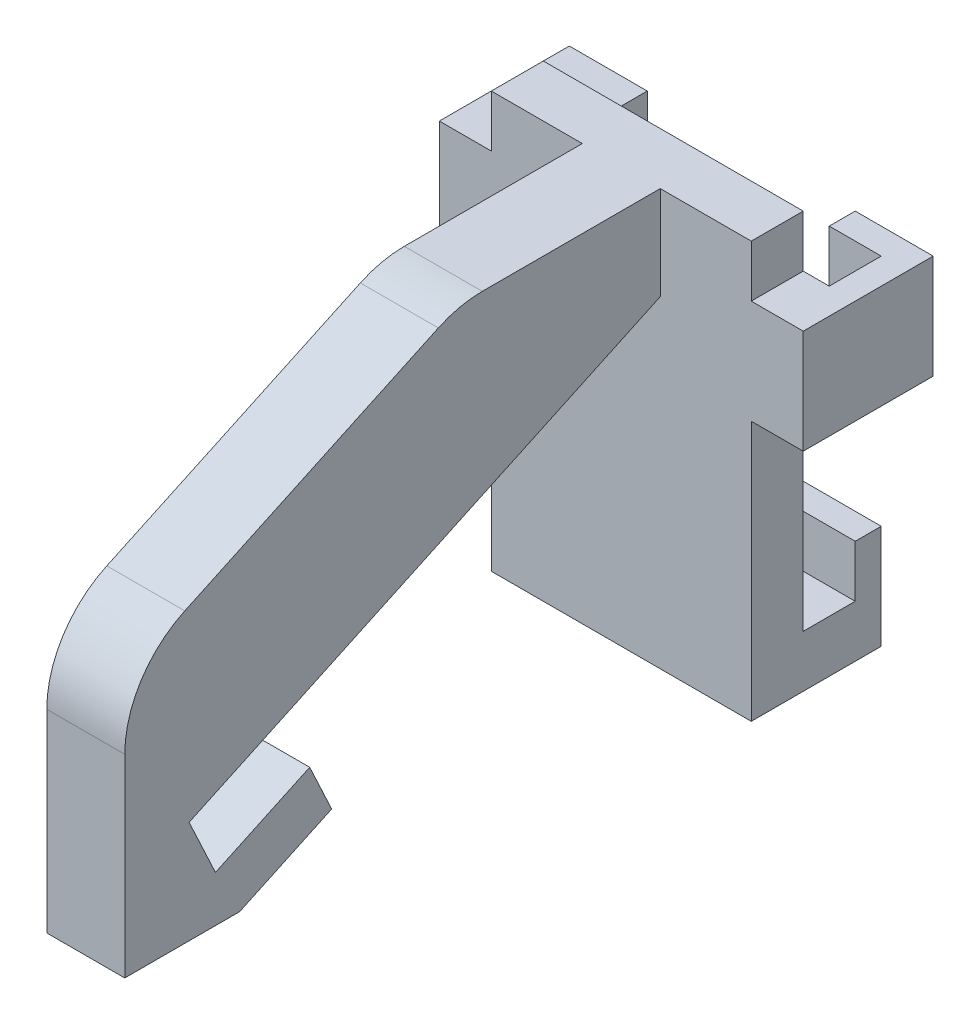
ISO-10303-21;
HEADER;
FILE_DESCRIPTION(('STEP AP214'),'2;1');
FILE_NAME('part.step','',(''),(''),'','','');
FILE_SCHEMA(('AUTOMOTIVE_DESIGN { 1 0 10303 214 1 1 1 1 }'));
ENDSEC;
DATA;
#1=APPLICATION_CONTEXT('core data for automotive mechanical design processes');
#2=APPLICATION_PROTOCOL_DEFINITION('international standard','automotive_design',2000,#1);
#3=PRODUCT_CONTEXT('',#1,'mechanical');
#4=PRODUCT('Part','Part','',(#3));
#5=PRODUCT_RELATED_PRODUCT_CATEGORY('part','',(#4));
#6=PRODUCT_DEFINITION_FORMATION('','',#4);
#7=PRODUCT_DEFINITION_CONTEXT('part definition',#1,'design');
#8=PRODUCT_DEFINITION('design','',#6,#7);
#9=PRODUCT_DEFINITION_SHAPE('','',#8);
#10=(LENGTH_UNIT() NAMED_UNIT(*) SI_UNIT(.MILLI.,.METRE.));
#11=(NAMED_UNIT(*) PLANE_ANGLE_UNIT() SI_UNIT($,.RADIAN.));
#12=(NAMED_UNIT(*) SI_UNIT($,.STERADIAN.) SOLID_ANGLE_UNIT());
#13=UNCERTAINTY_MEASURE_WITH_UNIT(LENGTH_MEASURE(1.E-05),#10,'distance_accuracy_value','');
#14=(GEOMETRIC_REPRESENTATION_CONTEXT(3) GLOBAL_UNCERTAINTY_ASSIGNED_CONTEXT((#13)) GLOBAL_UNIT_ASSIGNED_CONTEXT((#10,
#11,#12)) REPRESENTATION_CONTEXT('',''));
#15=CARTESIAN_POINT('',(0.,0.,0.));
#16=DIRECTION('',(0.,0.,1.));
#17=DIRECTION('',(1.,0.,0.));
#18=AXIS2_PLACEMENT_3D('',#15,#16,#17);
#19=CARTESIAN_POINT('',(32.5,37.2585947838501,83.0058124865376));
#20=DIRECTION('',(1.,0.,0.));
#21=DIRECTION('',(0.,0.,-1.));
#22=AXIS2_PLACEMENT_3D('',#19,#20,#21);
#23=CYLINDRICAL_SURFACE('',#22,20.);
#24=DIRECTION('',(1.,0.,0.));
#25=VECTOR('',#24,1.);
#26=CARTESIAN_POINT('',(32.5,55.3847505245831,91.4581777213517));
#27=LINE('',#26,#25);
#28=CARTESIAN_POINT('',(17.5,55.3847505245831,91.4581777213517));
#29=VERTEX_POINT('',#28);
#30=CARTESIAN_POINT('',(32.5,55.3847505245831,91.4581777213517));
#31=VERTEX_POINT('',#30);
#32=EDGE_CURVE('E326',#29,#31,#27,.T.);
#33=ORIENTED_EDGE('',*,*,#32,.F.);
#34=CARTESIAN_POINT('',(17.5,37.2585947838501,83.0058124865376));
#35=DIRECTION('',(-1.,0.,0.));
#36=DIRECTION('',(0.,0.,1.));
#37=AXIS2_PLACEMENT_3D('',#34,#35,#36);
#38=CIRCLE('',#37,20.);
#39=CARTESIAN_POINT('',(17.5,37.2585947838501,103.005812486538));
#40=VERTEX_POINT('',#39);
#41=EDGE_CURVE('E42',#40,#29,#38,.T.);
#42=ORIENTED_EDGE('',*,*,#41,.F.);
#43=DIRECTION('',(1.,0.,0.));
#44=VECTOR('',#43,1.);
#45=CARTESIAN_POINT('',(32.5,37.2585947838501,103.005812486538));
#46=LINE('',#45,#44);
#47=CARTESIAN_POINT('',(32.5,37.2585947838501,103.005812486538));
#48=VERTEX_POINT('',#47);
#49=EDGE_CURVE('E329',#48,#40,#46,.F.);
#50=ORIENTED_EDGE('',*,*,#49,.F.);
#51=CARTESIAN_POINT('',(32.5,37.2585947838501,83.0058124865376));
#52=DIRECTION('',(-1.,0.,0.));
#53=DIRECTION('',(0.,0.,1.));
#54=AXIS2_PLACEMENT_3D('',#51,#52,#53);
#55=CIRCLE('',#54,20.);
#56=EDGE_CURVE('E11',#31,#48,#55,.F.);
#57=ORIENTED_EDGE('',*,*,#56,.F.);
#58=EDGE_LOOP('',(#33,#42,#50,#57));
#59=FACE_BOUND('',#58,.T.);
#60=ADVANCED_FACE('F35',(#59),#23,.T.);
#61=CARTESIAN_POINT('',(50.,60.,34.2367116183924));
#62=DIRECTION('',(1.,0.,0.));
#63=DIRECTION('',(0.,0.,-1.));
#64=AXIS2_PLACEMENT_3D('',#61,#62,#63);
#65=CYLINDRICAL_SURFACE('',#64,20.);
#66=DIRECTION('',(1.,0.,0.));
#67=VECTOR('',#66,1.);
#68=CARTESIAN_POINT('',(50.,80.,34.2367116183924));
#69=LINE('',#68,#67);
#70=CARTESIAN_POINT('',(17.5,80.,34.2367116183924));
#71=VERTEX_POINT('',#70);
#72=CARTESIAN_POINT('',(32.5,80.,34.2367116183924));
#73=VERTEX_POINT('',#72);
#74=EDGE_CURVE('E274',#71,#73,#69,.T.);
#75=ORIENTED_EDGE('',*,*,#74,.F.);
#76=CARTESIAN_POINT('',(17.5,60.,34.2367116183924));
#77=DIRECTION('',(-1.,0.,0.));
#78=DIRECTION('',(0.,0.,1.));
#79=AXIS2_PLACEMENT_3D('',#76,#77,#78);
#80=CIRCLE('',#79,20.);
#81=CARTESIAN_POINT('',(17.5,78.126155740733,42.6890768532064));
#82=VERTEX_POINT('',#81);
#83=EDGE_CURVE('E322',#82,#71,#80,.T.);
#84=ORIENTED_EDGE('',*,*,#83,.F.);
#85=DIRECTION('',(1.,0.,0.));
#86=VECTOR('',#85,1.);
#87=CARTESIAN_POINT('',(32.5,78.126155740733,42.6890768532064));
#88=LINE('',#87,#86);
#89=CARTESIAN_POINT('',(32.5,78.126155740733,42.6890768532064));
#90=VERTEX_POINT('',#89);
#91=EDGE_CURVE('E319',#90,#82,#88,.F.);
#92=ORIENTED_EDGE('',*,*,#91,.F.);
#93=CARTESIAN_POINT('',(32.5,60.,34.2367116183924));
#94=DIRECTION('',(-1.,0.,0.));
#95=DIRECTION('',(0.,0.,1.));
#96=AXIS2_PLACEMENT_3D('',#93,#94,#95);
#97=CIRCLE('',#96,20.);
#98=EDGE_CURVE('E324',#73,#90,#97,.F.);
#99=ORIENTED_EDGE('',*,*,#98,.F.);
#100=EDGE_LOOP('',(#75,#84,#92,#99));
#101=FACE_BOUND('',#100,.T.);
#102=ADVANCED_FACE('F544',(#101),#65,.T.);
#103=CARTESIAN_POINT('',(0.,0.,0.));
#104=DIRECTION('',(1.,0.,0.));
#105=DIRECTION('',(0.,0.,-1.));
#106=AXIS2_PLACEMENT_3D('',#103,#104,#105);
#107=PLANE('',#106);
#108=DIRECTION('',(0.,0.,1.));
#109=VECTOR('',#108,1.);
#110=CARTESIAN_POINT('',(0.,50.,-10.));
#111=LINE('',#110,#109);
#112=CARTESIAN_POINT('',(0.,50.,-10.));
#113=VERTEX_POINT('',#112);
#114=CARTESIAN_POINT('',(0.,50.,0.));
#115=VERTEX_POINT('',#114);
#116=EDGE_CURVE('E382',#113,#115,#111,.T.);
#117=ORIENTED_EDGE('',*,*,#116,.F.);
#118=DIRECTION('',(0.,1.,0.));
#119=VECTOR('',#118,1.);
#120=CARTESIAN_POINT('',(0.,9.99999999999999,-10.));
#121=LINE('',#120,#119);
#122=CARTESIAN_POINT('',(0.,9.99999999999999,-10.));
#123=VERTEX_POINT('',#122);
#124=EDGE_CURVE('E523',#123,#113,#121,.T.);
#125=ORIENTED_EDGE('',*,*,#124,.F.);
#126=DIRECTION('',(0.,0.,1.));
#127=VECTOR('',#126,1.);
#128=CARTESIAN_POINT('',(0.,9.99999999999999,-20.));
#129=LINE('',#128,#127);
#130=CARTESIAN_POINT('',(0.,9.99999999999999,-20.));
#131=VERTEX_POINT('',#130);
#132=EDGE_CURVE('E521',#131,#123,#129,.T.);
#133=ORIENTED_EDGE('',*,*,#132,.F.);
#134=DIRECTION('',(0.,-1.,0.));
#135=VECTOR('',#134,1.);
#136=CARTESIAN_POINT('',(0.,20.,-20.));
#137=LINE('',#136,#135);
#138=CARTESIAN_POINT('',(0.,20.,-20.));
#139=VERTEX_POINT('',#138);
#140=EDGE_CURVE('E519',#139,#131,#137,.T.);
#141=ORIENTED_EDGE('',*,*,#140,.F.);
#142=DIRECTION('',(0.,0.,1.));
#143=VECTOR('',#142,1.);
#144=CARTESIAN_POINT('',(0.,20.,-25.));
#145=LINE('',#144,#143);
#146=CARTESIAN_POINT('',(0.,20.,-25.));
#147=VERTEX_POINT('',#146);
#148=EDGE_CURVE('E517',#147,#139,#145,.T.);
#149=ORIENTED_EDGE('',*,*,#148,.F.);
#150=DIRECTION('',(0.,1.,0.));
#151=VECTOR('',#150,1.);
#152=CARTESIAN_POINT('',(0.,0.,-25.));
#153=LINE('',#152,#151);
#154=CARTESIAN_POINT('',(0.,0.,-25.));
#155=VERTEX_POINT('',#154);
#156=EDGE_CURVE('E515',#155,#147,#153,.T.);
#157=ORIENTED_EDGE('',*,*,#156,.F.);
#158=DIRECTION('',(0.,0.,-1.));
#159=VECTOR('',#158,1.);
#160=CARTESIAN_POINT('',(0.,0.,0.));
#161=LINE('',#160,#159);
#162=CARTESIAN_POINT('',(0.,0.,0.));
#163=VERTEX_POINT('',#162);
#164=EDGE_CURVE('E513',#163,#155,#161,.T.);
#165=ORIENTED_EDGE('',*,*,#164,.F.);
#166=DIRECTION('',(0.,-1.,0.));
#167=VECTOR('',#166,1.);
#168=CARTESIAN_POINT('',(0.,80.,0.));
#169=LINE('',#168,#167);
#170=EDGE_CURVE('E483',#115,#163,#169,.T.);
#171=ORIENTED_EDGE('',*,*,#170,.F.);
#172=EDGE_LOOP('',(#117,#125,#133,#141,#149,#157,#165,#171));
#173=FACE_BOUND('',#172,.T.);
#174=ADVANCED_FACE('F604',(#173),#107,.F.);
#175=CARTESIAN_POINT('',(50.,0.,0.));
#176=DIRECTION('',(1.,0.,0.));
#177=DIRECTION('',(0.,0.,-1.));
#178=AXIS2_PLACEMENT_3D('',#175,#176,#177);
#179=PLANE('',#178);
#180=DIRECTION('',(0.,1.,0.));
#181=VECTOR('',#180,1.);
#182=CARTESIAN_POINT('',(50.,9.99999999999999,-10.));
#183=LINE('',#182,#181);
#184=CARTESIAN_POINT('',(50.,9.99999999999999,-10.));
#185=VERTEX_POINT('',#184);
#186=CARTESIAN_POINT('',(50.,50.,-10.));
#187=VERTEX_POINT('',#186);
#188=EDGE_CURVE('E507',#185,#187,#183,.T.);
#189=ORIENTED_EDGE('',*,*,#188,.T.);
#190=DIRECTION('',(0.,0.,1.));
#191=VECTOR('',#190,1.);
#192=CARTESIAN_POINT('',(50.,50.,-10.));
#193=LINE('',#192,#191);
#194=CARTESIAN_POINT('',(50.,50.,0.));
#195=VERTEX_POINT('',#194);
#196=EDGE_CURVE('E435',#187,#195,#193,.T.);
#197=ORIENTED_EDGE('',*,*,#196,.T.);
#198=DIRECTION('',(0.,-1.,0.));
#199=VECTOR('',#198,1.);
#200=CARTESIAN_POINT('',(50.,80.,0.));
#201=LINE('',#200,#199);
#202=CARTESIAN_POINT('',(50.,0.,0.));
#203=VERTEX_POINT('',#202);
#204=EDGE_CURVE('E496',#195,#203,#201,.T.);
#205=ORIENTED_EDGE('',*,*,#204,.T.);
#206=DIRECTION('',(0.,0.,-1.));
#207=VECTOR('',#206,1.);
#208=CARTESIAN_POINT('',(50.,0.,0.));
#209=LINE('',#208,#207);
#210=CARTESIAN_POINT('',(50.,0.,-25.));
#211=VERTEX_POINT('',#210);
#212=EDGE_CURVE('E495',#203,#211,#209,.T.);
#213=ORIENTED_EDGE('',*,*,#212,.T.);
#214=DIRECTION('',(0.,1.,0.));
#215=VECTOR('',#214,1.);
#216=CARTESIAN_POINT('',(50.,0.,-25.));
#217=LINE('',#216,#215);
#218=CARTESIAN_POINT('',(50.,20.,-25.));
#219=VERTEX_POINT('',#218);
#220=EDGE_CURVE('E498',#211,#219,#217,.T.);
#221=ORIENTED_EDGE('',*,*,#220,.T.);
#222=DIRECTION('',(0.,0.,1.));
#223=VECTOR('',#222,1.);
#224=CARTESIAN_POINT('',(50.,20.,-25.));
#225=LINE('',#224,#223);
#226=CARTESIAN_POINT('',(50.,20.,-20.));
#227=VERTEX_POINT('',#226);
#228=EDGE_CURVE('E500',#219,#227,#225,.T.);
#229=ORIENTED_EDGE('',*,*,#228,.T.);
#230=DIRECTION('',(0.,-1.,0.));
#231=VECTOR('',#230,1.);
#232=CARTESIAN_POINT('',(50.,20.,-20.));
#233=LINE('',#232,#231);
#234=CARTESIAN_POINT('',(50.,9.99999999999999,-20.));
#235=VERTEX_POINT('',#234);
#236=EDGE_CURVE('E502',#227,#235,#233,.T.);
#237=ORIENTED_EDGE('',*,*,#236,.T.);
#238=DIRECTION('',(0.,0.,1.));
#239=VECTOR('',#238,1.);
#240=CARTESIAN_POINT('',(50.,9.99999999999999,-20.));
#241=LINE('',#240,#239);
#242=EDGE_CURVE('E504',#235,#185,#241,.T.);
#243=ORIENTED_EDGE('',*,*,#242,.T.);
#244=EDGE_LOOP('',(#189,#197,#205,#213,#221,#229,#237,#243));
#245=FACE_BOUND('',#244,.T.);
#246=ADVANCED_FACE('F608',(#245),#179,.T.);
#247=CARTESIAN_POINT('',(50.,80.,0.));
#248=DIRECTION('',(0.,0.,-1.));
#249=DIRECTION('',(0.,1.,0.));
#250=AXIS2_PLACEMENT_3D('',#247,#248,#249);
#251=PLANE('',#250);
#252=DIRECTION('',(-1.,0.,0.));
#253=VECTOR('',#252,1.);
#254=CARTESIAN_POINT('',(32.5,62.,0.));
#255=LINE('',#254,#253);
#256=CARTESIAN_POINT('',(32.5,62.,0.));
#257=VERTEX_POINT('',#256);
#258=CARTESIAN_POINT('',(17.5,62.,0.));
#259=VERTEX_POINT('',#258);
#260=EDGE_CURVE('E361',#257,#259,#255,.T.);
#261=ORIENTED_EDGE('',*,*,#260,.T.);
#262=DIRECTION('',(0.,1.,0.));
#263=VECTOR('',#262,1.);
#264=CARTESIAN_POINT('',(17.5,80.,0.));
#265=LINE('',#264,#263);
#266=CARTESIAN_POINT('',(17.5,80.,0.));
#267=VERTEX_POINT('',#266);
#268=EDGE_CURVE('E346',#259,#267,#265,.T.);
#269=ORIENTED_EDGE('',*,*,#268,.T.);
#270=DIRECTION('',(-1.,0.,0.));
#271=VECTOR('',#270,1.);
#272=CARTESIAN_POINT('',(50.,80.,0.));
#273=LINE('',#272,#271);
#274=CARTESIAN_POINT('',(0.,80.,0.));
#275=VERTEX_POINT('',#274);
#276=EDGE_CURVE('E291',#267,#275,#273,.T.);
#277=ORIENTED_EDGE('',*,*,#276,.T.);
#278=CARTESIAN_POINT('',(0.,70.,0.));
#279=VERTEX_POINT('',#278);
#280=EDGE_CURVE('E510',#275,#279,#169,.T.);
#281=ORIENTED_EDGE('',*,*,#280,.T.);
#282=DIRECTION('',(-1.,0.,0.));
#283=VECTOR('',#282,1.);
#284=CARTESIAN_POINT('',(0.,70.,0.));
#285=LINE('',#284,#283);
#286=CARTESIAN_POINT('',(-10.,70.,0.));
#287=VERTEX_POINT('',#286);
#288=EDGE_CURVE('E386',#279,#287,#285,.T.);
#289=ORIENTED_EDGE('',*,*,#288,.T.);
#290=DIRECTION('',(0.,1.,0.));
#291=VECTOR('',#290,1.);
#292=CARTESIAN_POINT('',(-10.,50.,0.));
#293=LINE('',#292,#291);
#294=CARTESIAN_POINT('',(-10.,50.,0.));
#295=VERTEX_POINT('',#294);
#296=EDGE_CURVE('E417',#295,#287,#293,.T.);
#297=ORIENTED_EDGE('',*,*,#296,.F.);
#298=DIRECTION('',(-1.,0.,0.));
#299=VECTOR('',#298,1.);
#300=CARTESIAN_POINT('',(0.,50.,0.));
#301=LINE('',#300,#299);
#302=EDGE_CURVE('E399',#115,#295,#301,.T.);
#303=ORIENTED_EDGE('',*,*,#302,.F.);
#304=ORIENTED_EDGE('',*,*,#170,.T.);
#305=DIRECTION('',(-1.,0.,0.));
#306=VECTOR('',#305,1.);
#307=CARTESIAN_POINT('',(50.,0.,0.));
#308=LINE('',#307,#306);
#309=EDGE_CURVE('E315',#203,#163,#308,.T.);
#310=ORIENTED_EDGE('',*,*,#309,.F.);
#311=ORIENTED_EDGE('',*,*,#204,.F.);
#312=DIRECTION('',(1.,0.,0.));
#313=VECTOR('',#312,1.);
#314=CARTESIAN_POINT('',(50.,50.,0.));
#315=LINE('',#314,#313);
#316=CARTESIAN_POINT('',(60.,50.,0.));
#317=VERTEX_POINT('',#316);
#318=EDGE_CURVE('E437',#195,#317,#315,.T.);
#319=ORIENTED_EDGE('',*,*,#318,.T.);
#320=DIRECTION('',(0.,1.,0.));
#321=VECTOR('',#320,1.);
#322=CARTESIAN_POINT('',(60.,50.,0.));
#323=LINE('',#322,#321);
#324=CARTESIAN_POINT('',(60.,70.,0.));
#325=VERTEX_POINT('',#324);
#326=EDGE_CURVE('E458',#317,#325,#323,.T.);
#327=ORIENTED_EDGE('',*,*,#326,.T.);
#328=DIRECTION('',(1.,0.,0.));
#329=VECTOR('',#328,1.);
#330=CARTESIAN_POINT('',(50.,70.,0.));
#331=LINE('',#330,#329);
#332=CARTESIAN_POINT('',(50.,70.,0.));
#333=VERTEX_POINT('',#332);
#334=EDGE_CURVE('E461',#333,#325,#331,.T.);
#335=ORIENTED_EDGE('',*,*,#334,.F.);
#336=CARTESIAN_POINT('',(50.,80.,0.));
#337=VERTEX_POINT('',#336);
#338=EDGE_CURVE('E289',#337,#333,#201,.T.);
#339=ORIENTED_EDGE('',*,*,#338,.F.);
#340=CARTESIAN_POINT('',(32.5,80.,0.));
#341=VERTEX_POINT('',#340);
#342=EDGE_CURVE('E271',#337,#341,#273,.T.);
#343=ORIENTED_EDGE('',*,*,#342,.T.);
#344=DIRECTION('',(0.,1.,0.));
#345=VECTOR('',#344,1.);
#346=CARTESIAN_POINT('',(32.5,80.,0.));
#347=LINE('',#346,#345);
#348=EDGE_CURVE('E276',#257,#341,#347,.T.);
#349=ORIENTED_EDGE('',*,*,#348,.F.);
#350=EDGE_LOOP('',(#261,#269,#277,#281,#289,#297,#303,#304,#310,#311,#319,#327,#335,#339,#343,#349));
#351=FACE_BOUND('',#350,.T.);
#352=ADVANCED_FACE('F287',(#351),#251,.F.);
#353=CARTESIAN_POINT('',(50.,0.,0.));
#354=DIRECTION('',(0.,1.,0.));
#355=DIRECTION('',(0.,0.,1.));
#356=AXIS2_PLACEMENT_3D('',#353,#354,#355);
#357=PLANE('',#356);
#358=ORIENTED_EDGE('',*,*,#164,.T.);
#359=DIRECTION('',(-1.,0.,0.));
#360=VECTOR('',#359,1.);
#361=CARTESIAN_POINT('',(50.,0.,-25.));
#362=LINE('',#361,#360);
#363=EDGE_CURVE('E312',#211,#155,#362,.T.);
#364=ORIENTED_EDGE('',*,*,#363,.F.);
#365=ORIENTED_EDGE('',*,*,#212,.F.);
#366=ORIENTED_EDGE('',*,*,#309,.T.);
#367=EDGE_LOOP('',(#358,#364,#365,#366));
#368=FACE_BOUND('',#367,.T.);
#369=ADVANCED_FACE('F614',(#368),#357,.F.);
#370=CARTESIAN_POINT('',(50.,0.,-25.));
#371=DIRECTION('',(0.,0.,1.));
#372=DIRECTION('',(1.,0.,0.));
#373=AXIS2_PLACEMENT_3D('',#370,#371,#372);
#374=PLANE('',#373);
#375=ORIENTED_EDGE('',*,*,#156,.T.);
#376=DIRECTION('',(-1.,0.,0.));
#377=VECTOR('',#376,1.);
#378=CARTESIAN_POINT('',(50.,20.,-25.));
#379=LINE('',#378,#377);
#380=EDGE_CURVE('E309',#219,#147,#379,.T.);
#381=ORIENTED_EDGE('',*,*,#380,.F.);
#382=ORIENTED_EDGE('',*,*,#220,.F.);
#383=ORIENTED_EDGE('',*,*,#363,.T.);
#384=EDGE_LOOP('',(#375,#381,#382,#383));
#385=FACE_BOUND('',#384,.T.);
#386=ADVANCED_FACE('F617',(#385),#374,.F.);
#387=CARTESIAN_POINT('',(50.,20.,-25.));
#388=DIRECTION('',(0.,-1.,0.));
#389=DIRECTION('',(0.,0.,-1.));
#390=AXIS2_PLACEMENT_3D('',#387,#388,#389);
#391=PLANE('',#390);
#392=ORIENTED_EDGE('',*,*,#148,.T.);
#393=DIRECTION('',(-1.,0.,0.));
#394=VECTOR('',#393,1.);
#395=CARTESIAN_POINT('',(50.,20.,-20.));
#396=LINE('',#395,#394);
#397=EDGE_CURVE('E306',#227,#139,#396,.T.);
#398=ORIENTED_EDGE('',*,*,#397,.F.);
#399=ORIENTED_EDGE('',*,*,#228,.F.);
#400=ORIENTED_EDGE('',*,*,#380,.T.);
#401=EDGE_LOOP('',(#392,#398,#399,#400));
#402=FACE_BOUND('',#401,.T.);
#403=ADVANCED_FACE('F621',(#402),#391,.F.);
#404=CARTESIAN_POINT('',(50.,20.,-20.));
#405=DIRECTION('',(0.,0.,-1.));
#406=DIRECTION('',(-1.,0.,0.));
#407=AXIS2_PLACEMENT_3D('',#404,#405,#406);
#408=PLANE('',#407);
#409=ORIENTED_EDGE('',*,*,#140,.T.);
#410=DIRECTION('',(-1.,0.,0.));
#411=VECTOR('',#410,1.);
#412=CARTESIAN_POINT('',(50.,9.99999999999999,-20.));
#413=LINE('',#412,#411);
#414=EDGE_CURVE('E303',#235,#131,#413,.T.);
#415=ORIENTED_EDGE('',*,*,#414,.F.);
#416=ORIENTED_EDGE('',*,*,#236,.F.);
#417=ORIENTED_EDGE('',*,*,#397,.T.);
#418=EDGE_LOOP('',(#409,#415,#416,#417));
#419=FACE_BOUND('',#418,.T.);
#420=ADVANCED_FACE('F625',(#419),#408,.F.);
#421=CARTESIAN_POINT('',(50.,9.99999999999999,-20.));
#422=DIRECTION('',(0.,-1.,0.));
#423=DIRECTION('',(0.,0.,-1.));
#424=AXIS2_PLACEMENT_3D('',#421,#422,#423);
#425=PLANE('',#424);
#426=ORIENTED_EDGE('',*,*,#132,.T.);
#427=DIRECTION('',(-1.,0.,0.));
#428=VECTOR('',#427,1.);
#429=CARTESIAN_POINT('',(50.,9.99999999999999,-10.));
#430=LINE('',#429,#428);
#431=EDGE_CURVE('E294',#185,#123,#430,.T.);
#432=ORIENTED_EDGE('',*,*,#431,.F.);
#433=ORIENTED_EDGE('',*,*,#242,.F.);
#434=ORIENTED_EDGE('',*,*,#414,.T.);
#435=EDGE_LOOP('',(#426,#432,#433,#434));
#436=FACE_BOUND('',#435,.T.);
#437=ADVANCED_FACE('F629',(#436),#425,.F.);
#438=CARTESIAN_POINT('',(50.,9.99999999999999,-10.));
#439=DIRECTION('',(0.,0.,1.));
#440=DIRECTION('',(1.,0.,0.));
#441=AXIS2_PLACEMENT_3D('',#438,#439,#440);
#442=PLANE('',#441);
#443=ORIENTED_EDGE('',*,*,#124,.T.);
#444=DIRECTION('',(1.,0.,0.));
#445=VECTOR('',#444,1.);
#446=CARTESIAN_POINT('',(-5.,50.,-10.));
#447=LINE('',#446,#445);
#448=CARTESIAN_POINT('',(-5.,50.,-10.));
#449=VERTEX_POINT('',#448);
#450=EDGE_CURVE('E385',#449,#113,#447,.T.);
#451=ORIENTED_EDGE('',*,*,#450,.F.);
#452=DIRECTION('',(0.,1.,0.));
#453=VECTOR('',#452,1.);
#454=CARTESIAN_POINT('',(-5.,50.,-10.));
#455=LINE('',#454,#453);
#456=CARTESIAN_POINT('',(-5.,70.,-10.));
#457=VERTEX_POINT('',#456);
#458=EDGE_CURVE('E401',#449,#457,#455,.T.);
#459=ORIENTED_EDGE('',*,*,#458,.T.);
#460=DIRECTION('',(1.,0.,0.));
#461=VECTOR('',#460,1.);
#462=CARTESIAN_POINT('',(-5.,70.,-10.));
#463=LINE('',#462,#461);
#464=CARTESIAN_POINT('',(0.,70.,-10.));
#465=VERTEX_POINT('',#464);
#466=EDGE_CURVE('E404',#457,#465,#463,.T.);
#467=ORIENTED_EDGE('',*,*,#466,.T.);
#468=CARTESIAN_POINT('',(0.,80.,-10.));
#469=VERTEX_POINT('',#468);
#470=EDGE_CURVE('E522',#465,#469,#121,.T.);
#471=ORIENTED_EDGE('',*,*,#470,.T.);
#472=DIRECTION('',(-1.,0.,0.));
#473=VECTOR('',#472,1.);
#474=CARTESIAN_POINT('',(50.,80.,-10.));
#475=LINE('',#474,#473);
#476=CARTESIAN_POINT('',(50.,80.,-10.));
#477=VERTEX_POINT('',#476);
#478=EDGE_CURVE('E290',#477,#469,#475,.T.);
#479=ORIENTED_EDGE('',*,*,#478,.F.);
#480=CARTESIAN_POINT('',(50.,70.,-10.));
#481=VERTEX_POINT('',#480);
#482=EDGE_CURVE('E506',#481,#477,#183,.T.);
#483=ORIENTED_EDGE('',*,*,#482,.F.);
#484=DIRECTION('',(-1.,0.,0.));
#485=VECTOR('',#484,1.);
#486=CARTESIAN_POINT('',(55.,70.,-10.));
#487=LINE('',#486,#485);
#488=CARTESIAN_POINT('',(55.,70.,-10.));
#489=VERTEX_POINT('',#488);
#490=EDGE_CURVE('E438',#489,#481,#487,.T.);
#491=ORIENTED_EDGE('',*,*,#490,.F.);
#492=DIRECTION('',(0.,1.,0.));
#493=VECTOR('',#492,1.);
#494=CARTESIAN_POINT('',(55.,50.,-10.));
#495=LINE('',#494,#493);
#496=CARTESIAN_POINT('',(55.,50.,-10.));
#497=VERTEX_POINT('',#496);
#498=EDGE_CURVE('E481',#497,#489,#495,.T.);
#499=ORIENTED_EDGE('',*,*,#498,.F.);
#500=DIRECTION('',(-1.,0.,0.));
#501=VECTOR('',#500,1.);
#502=CARTESIAN_POINT('',(55.,50.,-10.));
#503=LINE('',#502,#501);
#504=EDGE_CURVE('E455',#497,#187,#503,.T.);
#505=ORIENTED_EDGE('',*,*,#504,.T.);
#506=ORIENTED_EDGE('',*,*,#188,.F.);
#507=ORIENTED_EDGE('',*,*,#431,.T.);
#508=EDGE_LOOP('',(#443,#451,#459,#467,#471,#479,#483,#491,#499,#505,#506,#507));
#509=FACE_BOUND('',#508,.T.);
#510=ADVANCED_FACE('F531',(#509),#442,.F.);
#511=CARTESIAN_POINT('',(50.,80.,-10.));
#512=DIRECTION('',(0.,-1.,0.));
#513=DIRECTION('',(0.,0.,-1.));
#514=AXIS2_PLACEMENT_3D('',#511,#512,#513);
#515=PLANE('',#514);
#516=DIRECTION('',(0.,0.,1.));
#517=VECTOR('',#516,1.);
#518=CARTESIAN_POINT('',(17.5,80.,0.));
#519=LINE('',#518,#517);
#520=EDGE_CURVE('E342',#267,#71,#519,.T.);
#521=ORIENTED_EDGE('',*,*,#520,.T.);
#522=ORIENTED_EDGE('',*,*,#74,.T.);
#523=DIRECTION('',(0.,0.,1.));
#524=VECTOR('',#523,1.);
#525=CARTESIAN_POINT('',(32.5,80.,0.));
#526=LINE('',#525,#524);
#527=EDGE_CURVE('E265',#341,#73,#526,.T.);
#528=ORIENTED_EDGE('',*,*,#527,.F.);
#529=ORIENTED_EDGE('',*,*,#342,.F.);
#530=DIRECTION('',(0.,0.,1.));
#531=VECTOR('',#530,1.);
#532=CARTESIAN_POINT('',(50.,80.,-10.));
#533=LINE('',#532,#531);
#534=EDGE_CURVE('E296',#477,#337,#533,.T.);
#535=ORIENTED_EDGE('',*,*,#534,.F.);
#536=ORIENTED_EDGE('',*,*,#478,.T.);
#537=DIRECTION('',(0.,0.,1.));
#538=VECTOR('',#537,1.);
#539=CARTESIAN_POINT('',(0.,80.,-10.));
#540=LINE('',#539,#538);
#541=EDGE_CURVE('E298',#469,#275,#540,.T.);
#542=ORIENTED_EDGE('',*,*,#541,.T.);
#543=ORIENTED_EDGE('',*,*,#276,.F.);
#544=EDGE_LOOP('',(#521,#522,#528,#529,#535,#536,#542,#543));
#545=FACE_BOUND('',#544,.T.);
#546=ADVANCED_FACE('F268',(#545),#515,.F.);
#547=DIRECTION('',(0.,0.,1.));
#548=VECTOR('',#547,1.);
#549=CARTESIAN_POINT('',(50.,70.,-10.));
#550=LINE('',#549,#548);
#551=EDGE_CURVE('E420',#481,#333,#550,.T.);
#552=ORIENTED_EDGE('',*,*,#551,.F.);
#553=ORIENTED_EDGE('',*,*,#482,.T.);
#554=ORIENTED_EDGE('',*,*,#534,.T.);
#555=ORIENTED_EDGE('',*,*,#338,.T.);
#556=EDGE_LOOP('',(#552,#553,#554,#555));
#557=FACE_BOUND('',#556,.T.);
#558=ADVANCED_FACE('F637',(#557),#179,.T.);
#559=ORIENTED_EDGE('',*,*,#470,.F.);
#560=DIRECTION('',(0.,0.,1.));
#561=VECTOR('',#560,1.);
#562=CARTESIAN_POINT('',(0.,70.,-10.));
#563=LINE('',#562,#561);
#564=EDGE_CURVE('E381',#465,#279,#563,.T.);
#565=ORIENTED_EDGE('',*,*,#564,.T.);
#566=ORIENTED_EDGE('',*,*,#280,.F.);
#567=ORIENTED_EDGE('',*,*,#541,.F.);
#568=EDGE_LOOP('',(#559,#565,#566,#567));
#569=FACE_BOUND('',#568,.T.);
#570=ADVANCED_FACE('F539',(#569),#107,.F.);
#571=CARTESIAN_POINT('',(55.,50.,-20.));
#572=DIRECTION('',(-1.,0.,0.));
#573=DIRECTION('',(0.,0.,1.));
#574=AXIS2_PLACEMENT_3D('',#571,#572,#573);
#575=PLANE('',#574);
#576=DIRECTION('',(0.,0.,1.));
#577=VECTOR('',#576,1.);
#578=CARTESIAN_POINT('',(55.,70.,-20.));
#579=LINE('',#578,#577);
#580=CARTESIAN_POINT('',(55.,70.,-20.));
#581=VERTEX_POINT('',#580);
#582=EDGE_CURVE('E476',#581,#489,#579,.T.);
#583=ORIENTED_EDGE('',*,*,#582,.F.);
#584=DIRECTION('',(0.,1.,0.));
#585=VECTOR('',#584,1.);
#586=CARTESIAN_POINT('',(55.,50.,-20.));
#587=LINE('',#586,#585);
#588=CARTESIAN_POINT('',(55.,50.,-20.));
#589=VERTEX_POINT('',#588);
#590=EDGE_CURVE('E484',#589,#581,#587,.T.);
#591=ORIENTED_EDGE('',*,*,#590,.F.);
#592=DIRECTION('',(0.,0.,1.));
#593=VECTOR('',#592,1.);
#594=CARTESIAN_POINT('',(55.,50.,-20.));
#595=LINE('',#594,#593);
#596=EDGE_CURVE('E452',#589,#497,#595,.T.);
#597=ORIENTED_EDGE('',*,*,#596,.T.);
#598=ORIENTED_EDGE('',*,*,#498,.T.);
#599=EDGE_LOOP('',(#583,#591,#597,#598));
#600=FACE_BOUND('',#599,.T.);
#601=ADVANCED_FACE('F640',(#600),#575,.T.);
#602=CARTESIAN_POINT('',(50.,50.,-20.));
#603=DIRECTION('',(0.,0.,1.));
#604=DIRECTION('',(1.,0.,0.));
#605=AXIS2_PLACEMENT_3D('',#602,#603,#604);
#606=PLANE('',#605);
#607=DIRECTION('',(1.,0.,0.));
#608=VECTOR('',#607,1.);
#609=CARTESIAN_POINT('',(50.,70.,-20.));
#610=LINE('',#609,#608);
#611=CARTESIAN_POINT('',(45.,70.,-20.));
#612=VERTEX_POINT('',#611);
#613=EDGE_CURVE('E473',#612,#581,#610,.T.);
#614=ORIENTED_EDGE('',*,*,#613,.F.);
#615=DIRECTION('',(0.,1.,0.));
#616=VECTOR('',#615,1.);
#617=CARTESIAN_POINT('',(45.,50.,-20.));
#618=LINE('',#617,#616);
#619=CARTESIAN_POINT('',(45.,50.,-20.));
#620=VERTEX_POINT('',#619);
#621=EDGE_CURVE('E486',#620,#612,#618,.T.);
#622=ORIENTED_EDGE('',*,*,#621,.F.);
#623=DIRECTION('',(1.,0.,0.));
#624=VECTOR('',#623,1.);
#625=CARTESIAN_POINT('',(45.,50.,-20.));
#626=LINE('',#625,#624);
#627=EDGE_CURVE('E450',#620,#589,#626,.T.);
#628=ORIENTED_EDGE('',*,*,#627,.T.);
#629=ORIENTED_EDGE('',*,*,#590,.T.);
#630=EDGE_LOOP('',(#614,#622,#628,#629));
#631=FACE_BOUND('',#630,.T.);
#632=ADVANCED_FACE('F656',(#631),#606,.T.);
#633=CARTESIAN_POINT('',(45.,50.,-25.));
#634=DIRECTION('',(-1.,0.,0.));
#635=DIRECTION('',(0.,0.,1.));
#636=AXIS2_PLACEMENT_3D('',#633,#634,#635);
#637=PLANE('',#636);
#638=DIRECTION('',(0.,0.,1.));
#639=VECTOR('',#638,1.);
#640=CARTESIAN_POINT('',(45.,70.,-25.));
#641=LINE('',#640,#639);
#642=CARTESIAN_POINT('',(45.,70.,-25.));
#643=VERTEX_POINT('',#642);
#644=EDGE_CURVE('E470',#643,#612,#641,.T.);
#645=ORIENTED_EDGE('',*,*,#644,.F.);
#646=DIRECTION('',(0.,1.,0.));
#647=VECTOR('',#646,1.);
#648=CARTESIAN_POINT('',(45.,50.,-25.));
#649=LINE('',#648,#647);
#650=CARTESIAN_POINT('',(45.,50.,-25.));
#651=VERTEX_POINT('',#650);
#652=EDGE_CURVE('E489',#651,#643,#649,.T.);
#653=ORIENTED_EDGE('',*,*,#652,.F.);
#654=DIRECTION('',(0.,0.,1.));
#655=VECTOR('',#654,1.);
#656=CARTESIAN_POINT('',(45.,50.,-25.));
#657=LINE('',#656,#655);
#658=EDGE_CURVE('E447',#651,#620,#657,.T.);
#659=ORIENTED_EDGE('',*,*,#658,.T.);
#660=ORIENTED_EDGE('',*,*,#621,.T.);
#661=EDGE_LOOP('',(#645,#653,#659,#660));
#662=FACE_BOUND('',#661,.T.);
#663=ADVANCED_FACE('F652',(#662),#637,.T.);
#664=CARTESIAN_POINT('',(60.,50.,-25.));
#665=DIRECTION('',(0.,0.,-1.));
#666=DIRECTION('',(-1.,0.,0.));
#667=AXIS2_PLACEMENT_3D('',#664,#665,#666);
#668=PLANE('',#667);
#669=DIRECTION('',(-1.,0.,0.));
#670=VECTOR('',#669,1.);
#671=CARTESIAN_POINT('',(60.,70.,-25.));
#672=LINE('',#671,#670);
#673=CARTESIAN_POINT('',(60.,70.,-25.));
#674=VERTEX_POINT('',#673);
#675=EDGE_CURVE('E467',#674,#643,#672,.T.);
#676=ORIENTED_EDGE('',*,*,#675,.F.);
#677=DIRECTION('',(0.,1.,0.));
#678=VECTOR('',#677,1.);
#679=CARTESIAN_POINT('',(60.,50.,-25.));
#680=LINE('',#679,#678);
#681=CARTESIAN_POINT('',(60.,50.,-25.));
#682=VERTEX_POINT('',#681);
#683=EDGE_CURVE('E491',#682,#674,#680,.T.);
#684=ORIENTED_EDGE('',*,*,#683,.F.);
#685=DIRECTION('',(-1.,0.,0.));
#686=VECTOR('',#685,1.);
#687=CARTESIAN_POINT('',(60.,50.,-25.));
#688=LINE('',#687,#686);
#689=EDGE_CURVE('E444',#682,#651,#688,.T.);
#690=ORIENTED_EDGE('',*,*,#689,.T.);
#691=ORIENTED_EDGE('',*,*,#652,.T.);
#692=EDGE_LOOP('',(#676,#684,#690,#691));
#693=FACE_BOUND('',#692,.T.);
#694=ADVANCED_FACE('F648',(#693),#668,.T.);
#695=CARTESIAN_POINT('',(60.,50.,0.));
#696=DIRECTION('',(1.,0.,0.));
#697=DIRECTION('',(0.,0.,-1.));
#698=AXIS2_PLACEMENT_3D('',#695,#696,#697);
#699=PLANE('',#698);
#700=DIRECTION('',(0.,0.,-1.));
#701=VECTOR('',#700,1.);
#702=CARTESIAN_POINT('',(60.,70.,0.));
#703=LINE('',#702,#701);
#704=EDGE_CURVE('E464',#325,#674,#703,.T.);
#705=ORIENTED_EDGE('',*,*,#704,.F.);
#706=ORIENTED_EDGE('',*,*,#326,.F.);
#707=DIRECTION('',(0.,0.,-1.));
#708=VECTOR('',#707,1.);
#709=CARTESIAN_POINT('',(60.,50.,0.));
#710=LINE('',#709,#708);
#711=EDGE_CURVE('E441',#317,#682,#710,.T.);
#712=ORIENTED_EDGE('',*,*,#711,.T.);
#713=ORIENTED_EDGE('',*,*,#683,.T.);
#714=EDGE_LOOP('',(#705,#706,#712,#713));
#715=FACE_BOUND('',#714,.T.);
#716=ADVANCED_FACE('F644',(#715),#699,.T.);
#717=CARTESIAN_POINT('',(0.,50.,0.));
#718=DIRECTION('',(0.,1.,0.));
#719=DIRECTION('',(0.,0.,1.));
#720=AXIS2_PLACEMENT_3D('',#717,#718,#719);
#721=PLANE('',#720);
#722=ORIENTED_EDGE('',*,*,#196,.F.);
#723=ORIENTED_EDGE('',*,*,#504,.F.);
#724=ORIENTED_EDGE('',*,*,#596,.F.);
#725=ORIENTED_EDGE('',*,*,#627,.F.);
#726=ORIENTED_EDGE('',*,*,#658,.F.);
#727=ORIENTED_EDGE('',*,*,#689,.F.);
#728=ORIENTED_EDGE('',*,*,#711,.F.);
#729=ORIENTED_EDGE('',*,*,#318,.F.);
#730=EDGE_LOOP('',(#722,#723,#724,#725,#726,#727,#728,#729));
#731=FACE_BOUND('',#730,.T.);
#732=ADVANCED_FACE('F647',(#731),#721,.F.);
#733=CARTESIAN_POINT('',(0.,70.,0.));
#734=DIRECTION('',(0.,1.,0.));
#735=DIRECTION('',(0.,0.,1.));
#736=AXIS2_PLACEMENT_3D('',#733,#734,#735);
#737=PLANE('',#736);
#738=ORIENTED_EDGE('',*,*,#551,.T.);
#739=ORIENTED_EDGE('',*,*,#334,.T.);
#740=ORIENTED_EDGE('',*,*,#704,.T.);
#741=ORIENTED_EDGE('',*,*,#675,.T.);
#742=ORIENTED_EDGE('',*,*,#644,.T.);
#743=ORIENTED_EDGE('',*,*,#613,.T.);
#744=ORIENTED_EDGE('',*,*,#582,.T.);
#745=ORIENTED_EDGE('',*,*,#490,.T.);
#746=EDGE_LOOP('',(#738,#739,#740,#741,#742,#743,#744,#745));
#747=FACE_BOUND('',#746,.T.);
#748=ADVANCED_FACE('F664',(#747),#737,.T.);
#749=CARTESIAN_POINT('',(-10.,50.,0.));
#750=DIRECTION('',(1.,0.,0.));
#751=DIRECTION('',(0.,0.,-1.));
#752=AXIS2_PLACEMENT_3D('',#749,#750,#751);
#753=PLANE('',#752);
#754=DIRECTION('',(0.,0.,-1.));
#755=VECTOR('',#754,1.);
#756=CARTESIAN_POINT('',(-10.,70.,0.));
#757=LINE('',#756,#755);
#758=CARTESIAN_POINT('',(-10.,70.,-25.));
#759=VERTEX_POINT('',#758);
#760=EDGE_CURVE('E414',#287,#759,#757,.T.);
#761=ORIENTED_EDGE('',*,*,#760,.T.);
#762=DIRECTION('',(0.,1.,0.));
#763=VECTOR('',#762,1.);
#764=CARTESIAN_POINT('',(-10.,50.,-25.));
#765=LINE('',#764,#763);
#766=CARTESIAN_POINT('',(-10.,50.,-25.));
#767=VERTEX_POINT('',#766);
#768=EDGE_CURVE('E421',#767,#759,#765,.T.);
#769=ORIENTED_EDGE('',*,*,#768,.F.);
#770=DIRECTION('',(0.,0.,-1.));
#771=VECTOR('',#770,1.);
#772=CARTESIAN_POINT('',(-10.,50.,0.));
#773=LINE('',#772,#771);
#774=EDGE_CURVE('E397',#295,#767,#773,.T.);
#775=ORIENTED_EDGE('',*,*,#774,.F.);
#776=ORIENTED_EDGE('',*,*,#296,.T.);
#777=EDGE_LOOP('',(#761,#769,#775,#776));
#778=FACE_BOUND('',#777,.T.);
#779=ADVANCED_FACE('F667',(#778),#753,.F.);
#780=CARTESIAN_POINT('',(-10.,50.,-25.));
#781=DIRECTION('',(0.,0.,1.));
#782=DIRECTION('',(1.,0.,0.));
#783=AXIS2_PLACEMENT_3D('',#780,#781,#782);
#784=PLANE('',#783);
#785=DIRECTION('',(1.,0.,0.));
#786=VECTOR('',#785,1.);
#787=CARTESIAN_POINT('',(-10.,70.,-25.));
#788=LINE('',#787,#786);
#789=CARTESIAN_POINT('',(5.,70.,-25.));
#790=VERTEX_POINT('',#789);
#791=EDGE_CURVE('E412',#759,#790,#788,.T.);
#792=ORIENTED_EDGE('',*,*,#791,.T.);
#793=DIRECTION('',(0.,1.,0.));
#794=VECTOR('',#793,1.);
#795=CARTESIAN_POINT('',(5.,50.,-25.));
#796=LINE('',#795,#794);
#797=CARTESIAN_POINT('',(5.,50.,-25.));
#798=VERTEX_POINT('',#797);
#799=EDGE_CURVE('E424',#798,#790,#796,.T.);
#800=ORIENTED_EDGE('',*,*,#799,.F.);
#801=DIRECTION('',(1.,0.,0.));
#802=VECTOR('',#801,1.);
#803=CARTESIAN_POINT('',(-10.,50.,-25.));
#804=LINE('',#803,#802);
#805=EDGE_CURVE('E395',#767,#798,#804,.T.);
#806=ORIENTED_EDGE('',*,*,#805,.F.);
#807=ORIENTED_EDGE('',*,*,#768,.T.);
#808=EDGE_LOOP('',(#792,#800,#806,#807));
#809=FACE_BOUND('',#808,.T.);
#810=ADVANCED_FACE('F684',(#809),#784,.F.);
#811=CARTESIAN_POINT('',(5.,50.,-25.));
#812=DIRECTION('',(-1.,0.,0.));
#813=DIRECTION('',(0.,0.,1.));
#814=AXIS2_PLACEMENT_3D('',#811,#812,#813);
#815=PLANE('',#814);
#816=DIRECTION('',(0.,0.,1.));
#817=VECTOR('',#816,1.);
#818=CARTESIAN_POINT('',(5.,70.,-25.));
#819=LINE('',#818,#817);
#820=CARTESIAN_POINT('',(5.,70.,-20.));
#821=VERTEX_POINT('',#820);
#822=EDGE_CURVE('E410',#790,#821,#819,.T.);
#823=ORIENTED_EDGE('',*,*,#822,.T.);
#824=DIRECTION('',(0.,1.,0.));
#825=VECTOR('',#824,1.);
#826=CARTESIAN_POINT('',(5.,50.,-20.));
#827=LINE('',#826,#825);
#828=CARTESIAN_POINT('',(5.,50.,-20.));
#829=VERTEX_POINT('',#828);
#830=EDGE_CURVE('E427',#829,#821,#827,.T.);
#831=ORIENTED_EDGE('',*,*,#830,.F.);
#832=DIRECTION('',(0.,0.,1.));
#833=VECTOR('',#832,1.);
#834=CARTESIAN_POINT('',(5.,50.,-25.));
#835=LINE('',#834,#833);
#836=EDGE_CURVE('E392',#798,#829,#835,.T.);
#837=ORIENTED_EDGE('',*,*,#836,.F.);
#838=ORIENTED_EDGE('',*,*,#799,.T.);
#839=EDGE_LOOP('',(#823,#831,#837,#838));
#840=FACE_BOUND('',#839,.T.);
#841=ADVANCED_FACE('F680',(#840),#815,.F.);
#842=CARTESIAN_POINT('',(5.,50.,-20.));
#843=DIRECTION('',(0.,0.,-1.));
#844=DIRECTION('',(-1.,0.,0.));
#845=AXIS2_PLACEMENT_3D('',#842,#843,#844);
#846=PLANE('',#845);
#847=DIRECTION('',(-1.,0.,0.));
#848=VECTOR('',#847,1.);
#849=CARTESIAN_POINT('',(5.,70.,-20.));
#850=LINE('',#849,#848);
#851=CARTESIAN_POINT('',(-5.,70.,-20.));
#852=VERTEX_POINT('',#851);
#853=EDGE_CURVE('E408',#821,#852,#850,.T.);
#854=ORIENTED_EDGE('',*,*,#853,.T.);
#855=DIRECTION('',(0.,1.,0.));
#856=VECTOR('',#855,1.);
#857=CARTESIAN_POINT('',(-5.,50.,-20.));
#858=LINE('',#857,#856);
#859=CARTESIAN_POINT('',(-5.,50.,-20.));
#860=VERTEX_POINT('',#859);
#861=EDGE_CURVE('E430',#860,#852,#858,.T.);
#862=ORIENTED_EDGE('',*,*,#861,.F.);
#863=DIRECTION('',(-1.,0.,0.));
#864=VECTOR('',#863,1.);
#865=CARTESIAN_POINT('',(0.,50.,-20.));
#866=LINE('',#865,#864);
#867=EDGE_CURVE('E390',#829,#860,#866,.T.);
#868=ORIENTED_EDGE('',*,*,#867,.F.);
#869=ORIENTED_EDGE('',*,*,#830,.T.);
#870=EDGE_LOOP('',(#854,#862,#868,#869));
#871=FACE_BOUND('',#870,.T.);
#872=ADVANCED_FACE('F676',(#871),#846,.F.);
#873=CARTESIAN_POINT('',(-5.,50.,-20.));
#874=DIRECTION('',(-1.,0.,0.));
#875=DIRECTION('',(0.,0.,1.));
#876=AXIS2_PLACEMENT_3D('',#873,#874,#875);
#877=PLANE('',#876);
#878=DIRECTION('',(0.,0.,1.));
#879=VECTOR('',#878,1.);
#880=CARTESIAN_POINT('',(-5.,70.,-20.));
#881=LINE('',#880,#879);
#882=EDGE_CURVE('E406',#852,#457,#881,.T.);
#883=ORIENTED_EDGE('',*,*,#882,.T.);
#884=ORIENTED_EDGE('',*,*,#458,.F.);
#885=DIRECTION('',(0.,0.,1.));
#886=VECTOR('',#885,1.);
#887=CARTESIAN_POINT('',(-5.,50.,-20.));
#888=LINE('',#887,#886);
#889=EDGE_CURVE('E388',#860,#449,#888,.T.);
#890=ORIENTED_EDGE('',*,*,#889,.F.);
#891=ORIENTED_EDGE('',*,*,#861,.T.);
#892=EDGE_LOOP('',(#883,#884,#890,#891));
#893=FACE_BOUND('',#892,.T.);
#894=ADVANCED_FACE('F672',(#893),#877,.F.);
#895=CARTESIAN_POINT('',(50.,50.,0.));
#896=DIRECTION('',(0.,1.,0.));
#897=DIRECTION('',(0.,0.,1.));
#898=AXIS2_PLACEMENT_3D('',#895,#896,#897);
#899=PLANE('',#898);
#900=ORIENTED_EDGE('',*,*,#116,.T.);
#901=ORIENTED_EDGE('',*,*,#302,.T.);
#902=ORIENTED_EDGE('',*,*,#774,.T.);
#903=ORIENTED_EDGE('',*,*,#805,.T.);
#904=ORIENTED_EDGE('',*,*,#836,.T.);
#905=ORIENTED_EDGE('',*,*,#867,.T.);
#906=ORIENTED_EDGE('',*,*,#889,.T.);
#907=ORIENTED_EDGE('',*,*,#450,.T.);
#908=EDGE_LOOP('',(#900,#901,#902,#903,#904,#905,#906,#907));
#909=FACE_BOUND('',#908,.T.);
#910=ADVANCED_FACE('F675',(#909),#899,.F.);
#911=CARTESIAN_POINT('',(50.,70.,0.));
#912=DIRECTION('',(0.,1.,0.));
#913=DIRECTION('',(0.,0.,1.));
#914=AXIS2_PLACEMENT_3D('',#911,#912,#913);
#915=PLANE('',#914);
#916=ORIENTED_EDGE('',*,*,#564,.F.);
#917=ORIENTED_EDGE('',*,*,#466,.F.);
#918=ORIENTED_EDGE('',*,*,#882,.F.);
#919=ORIENTED_EDGE('',*,*,#853,.F.);
#920=ORIENTED_EDGE('',*,*,#822,.F.);
#921=ORIENTED_EDGE('',*,*,#791,.F.);
#922=ORIENTED_EDGE('',*,*,#760,.F.);
#923=ORIENTED_EDGE('',*,*,#288,.F.);
#924=EDGE_LOOP('',(#916,#917,#918,#919,#920,#921,#922,#923));
#925=FACE_BOUND('',#924,.T.);
#926=ADVANCED_FACE('F597',(#925),#915,.T.);
#927=CARTESIAN_POINT('',(32.5,80.,38.6706048712512));
#928=DIRECTION('',(0.,-0.906307787036649,-0.422618261740701));
#929=DIRECTION('',(0.,0.422618261740701,-0.906307787036649));
#930=AXIS2_PLACEMENT_3D('',#927,#928,#929);
#931=PLANE('',#930);
#932=DIRECTION('',(0.,-0.422618261740701,0.906307787036649));
#933=VECTOR('',#932,1.);
#934=CARTESIAN_POINT('',(17.5,80.,38.6706048712512));
#935=LINE('',#934,#933);
#936=EDGE_CURVE('E335',#82,#29,#935,.T.);
#937=ORIENTED_EDGE('',*,*,#936,.T.);
#938=ORIENTED_EDGE('',*,*,#32,.T.);
#939=DIRECTION('',(0.,-0.422618261740701,0.906307787036649));
#940=VECTOR('',#939,1.);
#941=CARTESIAN_POINT('',(32.5,80.,38.6706048712512));
#942=LINE('',#941,#940);
#943=EDGE_CURVE('E275',#90,#31,#942,.T.);
#944=ORIENTED_EDGE('',*,*,#943,.F.);
#945=ORIENTED_EDGE('',*,*,#91,.T.);
#946=EDGE_LOOP('',(#937,#938,#944,#945));
#947=FACE_BOUND('',#946,.T.);
#948=ADVANCED_FACE('F340',(#947),#931,.F.);
#949=CARTESIAN_POINT('',(32.5,50.,103.005812486538));
#950=DIRECTION('',(0.,0.,-1.));
#951=DIRECTION('',(0.,1.,0.));
#952=AXIS2_PLACEMENT_3D('',#949,#950,#951);
#953=PLANE('',#952);
#954=DIRECTION('',(0.,-1.,0.));
#955=VECTOR('',#954,1.);
#956=CARTESIAN_POINT('',(32.5,50.,103.005812486538));
#957=LINE('',#956,#955);
#958=CARTESIAN_POINT('',(32.5,0.,103.005812486538));
#959=VERTEX_POINT('',#958);
#960=EDGE_CURVE('E545',#48,#959,#957,.T.);
#961=ORIENTED_EDGE('',*,*,#960,.F.);
#962=ORIENTED_EDGE('',*,*,#49,.T.);
#963=DIRECTION('',(0.,-1.,0.));
#964=VECTOR('',#963,1.);
#965=CARTESIAN_POINT('',(17.5,50.,103.005812486538));
#966=LINE('',#965,#964);
#967=CARTESIAN_POINT('',(17.5,0.,103.005812486538));
#968=VERTEX_POINT('',#967);
#969=EDGE_CURVE('E337',#40,#968,#966,.T.);
#970=ORIENTED_EDGE('',*,*,#969,.T.);
#971=DIRECTION('',(-1.,0.,0.));
#972=VECTOR('',#971,1.);
#973=CARTESIAN_POINT('',(32.5,0.,103.005812486538));
#974=LINE('',#973,#972);
#975=EDGE_CURVE('E378',#959,#968,#974,.T.);
#976=ORIENTED_EDGE('',*,*,#975,.F.);
#977=EDGE_LOOP('',(#961,#962,#970,#976));
#978=FACE_BOUND('',#977,.T.);
#979=ADVANCED_FACE('F588',(#978),#953,.F.);
#980=CARTESIAN_POINT('',(32.5,0.,80.9029942422373));
#981=DIRECTION('',(0.,1.,0.));
#982=DIRECTION('',(0.,0.,1.));
#983=AXIS2_PLACEMENT_3D('',#980,#981,#982);
#984=PLANE('',#983);
#985=DIRECTION('',(0.,0.,-1.));
#986=VECTOR('',#985,1.);
#987=CARTESIAN_POINT('',(17.5,0.,80.9029942422373));
#988=LINE('',#987,#986);
#989=CARTESIAN_POINT('',(17.5,0.,80.9029942422373));
#990=VERTEX_POINT('',#989);
#991=EDGE_CURVE('E344',#968,#990,#988,.T.);
#992=ORIENTED_EDGE('',*,*,#991,.T.);
#993=DIRECTION('',(-1.,0.,0.));
#994=VECTOR('',#993,1.);
#995=CARTESIAN_POINT('',(32.5,0.,80.9029942422373));
#996=LINE('',#995,#994);
#997=CARTESIAN_POINT('',(32.5,0.,80.9029942422373));
#998=VERTEX_POINT('',#997);
#999=EDGE_CURVE('E375',#998,#990,#996,.T.);
#1000=ORIENTED_EDGE('',*,*,#999,.F.);
#1001=DIRECTION('',(0.,0.,-1.));
#1002=VECTOR('',#1001,1.);
#1003=CARTESIAN_POINT('',(32.5,0.,80.9029942422373));
#1004=LINE('',#1003,#1002);
#1005=EDGE_CURVE('E547',#959,#998,#1004,.T.);
#1006=ORIENTED_EDGE('',*,*,#1005,.F.);
#1007=ORIENTED_EDGE('',*,*,#975,.T.);
#1008=EDGE_LOOP('',(#992,#1000,#1006,#1007));
#1009=FACE_BOUND('',#1008,.T.);
#1010=ADVANCED_FACE('F583',(#1009),#984,.F.);
#1011=CARTESIAN_POINT('',(32.5,8.25176774593774,63.2070212046365));
#1012=DIRECTION('',(0.,0.906307787036648,0.422618261740704));
#1013=DIRECTION('',(0.,-0.422618261740704,0.906307787036648));
#1014=AXIS2_PLACEMENT_3D('',#1011,#1012,#1013);
#1015=PLANE('',#1014);
#1016=DIRECTION('',(0.,0.422618261740704,-0.906307787036648));
#1017=VECTOR('',#1016,1.);
#1018=CARTESIAN_POINT('',(17.5,8.25176774593774,63.2070212046365));
#1019=LINE('',#1018,#1017);
#1020=CARTESIAN_POINT('',(17.5,8.25176774593774,63.2070212046365));
#1021=VERTEX_POINT('',#1020);
#1022=EDGE_CURVE('E351',#990,#1021,#1019,.T.);
#1023=ORIENTED_EDGE('',*,*,#1022,.T.);
#1024=DIRECTION('',(-1.,0.,0.));
#1025=VECTOR('',#1024,1.);
#1026=CARTESIAN_POINT('',(32.5,8.25176774593774,63.2070212046365));
#1027=LINE('',#1026,#1025);
#1028=CARTESIAN_POINT('',(32.5,8.25176774593774,63.2070212046365));
#1029=VERTEX_POINT('',#1028);
#1030=EDGE_CURVE('E372',#1029,#1021,#1027,.T.);
#1031=ORIENTED_EDGE('',*,*,#1030,.F.);
#1032=DIRECTION('',(0.,0.422618261740704,-0.906307787036648));
#1033=VECTOR('',#1032,1.);
#1034=CARTESIAN_POINT('',(32.5,8.25176774593774,63.2070212046365));
#1035=LINE('',#1034,#1033);
#1036=EDGE_CURVE('E551',#998,#1029,#1035,.T.);
#1037=ORIENTED_EDGE('',*,*,#1036,.F.);
#1038=ORIENTED_EDGE('',*,*,#999,.T.);
#1039=EDGE_LOOP('',(#1023,#1031,#1037,#1038));
#1040=FACE_BOUND('',#1039,.T.);
#1041=ADVANCED_FACE('F580',(#1040),#1015,.F.);
#1042=CARTESIAN_POINT('',(32.5,17.3148456163042,67.4332038220435));
#1043=DIRECTION('',(0.,-0.422618261740704,0.906307787036648));
#1044=DIRECTION('',(0.,-0.906307787036648,-0.422618261740704));
#1045=AXIS2_PLACEMENT_3D('',#1042,#1043,#1044);
#1046=PLANE('',#1045);
#1047=DIRECTION('',(0.,0.906307787036648,0.422618261740704));
#1048=VECTOR('',#1047,1.);
#1049=CARTESIAN_POINT('',(17.5,17.3148456163042,67.4332038220435));
#1050=LINE('',#1049,#1048);
#1051=CARTESIAN_POINT('',(17.5,17.3148456163042,67.4332038220435));
#1052=VERTEX_POINT('',#1051);
#1053=EDGE_CURVE('E353',#1021,#1052,#1050,.T.);
#1054=ORIENTED_EDGE('',*,*,#1053,.T.);
#1055=DIRECTION('',(-1.,0.,0.));
#1056=VECTOR('',#1055,1.);
#1057=CARTESIAN_POINT('',(32.5,17.3148456163042,67.4332038220435));
#1058=LINE('',#1057,#1056);
#1059=CARTESIAN_POINT('',(32.5,17.3148456163042,67.4332038220435));
#1060=VERTEX_POINT('',#1059);
#1061=EDGE_CURVE('E369',#1060,#1052,#1058,.T.);
#1062=ORIENTED_EDGE('',*,*,#1061,.F.);
#1063=DIRECTION('',(0.,0.906307787036648,0.422618261740704));
#1064=VECTOR('',#1063,1.);
#1065=CARTESIAN_POINT('',(32.5,17.3148456163042,67.4332038220435));
#1066=LINE('',#1065,#1064);
#1067=EDGE_CURVE('E553',#1029,#1060,#1066,.T.);
#1068=ORIENTED_EDGE('',*,*,#1067,.F.);
#1069=ORIENTED_EDGE('',*,*,#1030,.T.);
#1070=EDGE_LOOP('',(#1054,#1062,#1068,#1069));
#1071=FACE_BOUND('',#1070,.T.);
#1072=ADVANCED_FACE('F576',(#1071),#1046,.F.);
#1073=CARTESIAN_POINT('',(32.5,8.86248038149013,85.5593595627765));
#1074=DIRECTION('',(0.,-0.906307787036647,-0.422618261740705));
#1075=DIRECTION('',(0.,0.422618261740705,-0.906307787036648));
#1076=AXIS2_PLACEMENT_3D('',#1073,#1074,#1075);
#1077=PLANE('',#1076);
#1078=DIRECTION('',(0.,-0.422618261740705,0.906307787036647));
#1079=VECTOR('',#1078,1.);
#1080=CARTESIAN_POINT('',(17.5,8.86248038149013,85.5593595627765));
#1081=LINE('',#1080,#1079);
#1082=CARTESIAN_POINT('',(17.5,8.86248038149013,85.5593595627765));
#1083=VERTEX_POINT('',#1082);
#1084=EDGE_CURVE('E355',#1052,#1083,#1081,.T.);
#1085=ORIENTED_EDGE('',*,*,#1084,.T.);
#1086=DIRECTION('',(-1.,0.,0.));
#1087=VECTOR('',#1086,1.);
#1088=CARTESIAN_POINT('',(32.5,8.86248038149013,85.5593595627765));
#1089=LINE('',#1088,#1087);
#1090=CARTESIAN_POINT('',(32.5,8.86248038149013,85.5593595627765));
#1091=VERTEX_POINT('',#1090);
#1092=EDGE_CURVE('E366',#1091,#1083,#1089,.T.);
#1093=ORIENTED_EDGE('',*,*,#1092,.F.);
#1094=DIRECTION('',(0.,-0.422618261740705,0.906307787036647));
#1095=VECTOR('',#1094,1.);
#1096=CARTESIAN_POINT('',(32.5,8.86248038149013,85.5593595627765));
#1097=LINE('',#1096,#1095);
#1098=EDGE_CURVE('E555',#1060,#1091,#1097,.T.);
#1099=ORIENTED_EDGE('',*,*,#1098,.F.);
#1100=ORIENTED_EDGE('',*,*,#1061,.T.);
#1101=EDGE_LOOP('',(#1085,#1093,#1099,#1100));
#1102=FACE_BOUND('',#1101,.T.);
#1103=ADVANCED_FACE('F572',(#1102),#1077,.F.);
#1104=CARTESIAN_POINT('',(32.5,19.7381738259299,90.6307787036649));
#1105=DIRECTION('',(0.,-0.422618261740704,0.906307787036648));
#1106=DIRECTION('',(0.,-0.906307787036648,-0.422618261740704));
#1107=AXIS2_PLACEMENT_3D('',#1104,#1105,#1106);
#1108=PLANE('',#1107);
#1109=DIRECTION('',(0.,0.906307787036648,0.422618261740704));
#1110=VECTOR('',#1109,1.);
#1111=CARTESIAN_POINT('',(17.5,19.7381738259299,90.6307787036649));
#1112=LINE('',#1111,#1110);
#1113=CARTESIAN_POINT('',(17.5,19.7381738259299,90.6307787036649));
#1114=VERTEX_POINT('',#1113);
#1115=EDGE_CURVE('E357',#1083,#1114,#1112,.T.);
#1116=ORIENTED_EDGE('',*,*,#1115,.T.);
#1117=DIRECTION('',(-1.,0.,0.));
#1118=VECTOR('',#1117,1.);
#1119=CARTESIAN_POINT('',(32.5,19.7381738259299,90.6307787036649));
#1120=LINE('',#1119,#1118);
#1121=CARTESIAN_POINT('',(32.5,19.7381738259299,90.6307787036649));
#1122=VERTEX_POINT('',#1121);
#1123=EDGE_CURVE('E363',#1122,#1114,#1120,.T.);
#1124=ORIENTED_EDGE('',*,*,#1123,.F.);
#1125=DIRECTION('',(0.,0.906307787036648,0.422618261740704));
#1126=VECTOR('',#1125,1.);
#1127=CARTESIAN_POINT('',(32.5,19.7381738259299,90.6307787036649));
#1128=LINE('',#1127,#1126);
#1129=EDGE_CURVE('E557',#1091,#1122,#1128,.T.);
#1130=ORIENTED_EDGE('',*,*,#1129,.F.);
#1131=ORIENTED_EDGE('',*,*,#1092,.T.);
#1132=EDGE_LOOP('',(#1116,#1124,#1130,#1131));
#1133=FACE_BOUND('',#1132,.T.);
#1134=ADVANCED_FACE('F564',(#1133),#1108,.F.);
#1135=CARTESIAN_POINT('',(32.5,62.,0.));
#1136=DIRECTION('',(0.,0.906307787036649,0.422618261740701));
#1137=DIRECTION('',(0.,-0.422618261740701,0.906307787036649));
#1138=AXIS2_PLACEMENT_3D('',#1135,#1136,#1137);
#1139=PLANE('',#1138);
#1140=DIRECTION('',(0.,0.422618261740701,-0.906307787036649));
#1141=VECTOR('',#1140,1.);
#1142=CARTESIAN_POINT('',(17.5,62.,0.));
#1143=LINE('',#1142,#1141);
#1144=EDGE_CURVE('E285',#1114,#259,#1143,.T.);
#1145=ORIENTED_EDGE('',*,*,#1144,.T.);
#1146=ORIENTED_EDGE('',*,*,#260,.F.);
#1147=DIRECTION('',(0.,0.422618261740701,-0.906307787036649));
#1148=VECTOR('',#1147,1.);
#1149=CARTESIAN_POINT('',(32.5,62.,0.));
#1150=LINE('',#1149,#1148);
#1151=EDGE_CURVE('E281',#1122,#257,#1150,.T.);
#1152=ORIENTED_EDGE('',*,*,#1151,.F.);
#1153=ORIENTED_EDGE('',*,*,#1123,.T.);
#1154=EDGE_LOOP('',(#1145,#1146,#1152,#1153));
#1155=FACE_BOUND('',#1154,.T.);
#1156=ADVANCED_FACE('F567',(#1155),#1139,.F.);
#1157=CARTESIAN_POINT('',(32.5,0.,0.));
#1158=DIRECTION('',(-1.,0.,0.));
#1159=DIRECTION('',(0.,0.,1.));
#1160=AXIS2_PLACEMENT_3D('',#1157,#1158,#1159);
#1161=PLANE('',#1160);
#1162=ORIENTED_EDGE('',*,*,#943,.T.);
#1163=ORIENTED_EDGE('',*,*,#56,.T.);
#1164=ORIENTED_EDGE('',*,*,#960,.T.);
#1165=ORIENTED_EDGE('',*,*,#1005,.T.);
#1166=ORIENTED_EDGE('',*,*,#1036,.T.);
#1167=ORIENTED_EDGE('',*,*,#1067,.T.);
#1168=ORIENTED_EDGE('',*,*,#1098,.T.);
#1169=ORIENTED_EDGE('',*,*,#1129,.T.);
#1170=ORIENTED_EDGE('',*,*,#1151,.T.);
#1171=ORIENTED_EDGE('',*,*,#348,.T.);
#1172=ORIENTED_EDGE('',*,*,#527,.T.);
#1173=ORIENTED_EDGE('',*,*,#98,.T.);
#1174=EDGE_LOOP('',(#1162,#1163,#1164,#1165,#1166,#1167,#1168,#1169,#1170,#1171,#1172,#1173));
#1175=FACE_BOUND('',#1174,.T.);
#1176=ADVANCED_FACE('F279',(#1175),#1161,.F.);
#1177=CARTESIAN_POINT('',(17.5,0.,0.));
#1178=DIRECTION('',(-1.,0.,0.));
#1179=DIRECTION('',(0.,0.,1.));
#1180=AXIS2_PLACEMENT_3D('',#1177,#1178,#1179);
#1181=PLANE('',#1180);
#1182=ORIENTED_EDGE('',*,*,#969,.F.);
#1183=ORIENTED_EDGE('',*,*,#41,.T.);
#1184=ORIENTED_EDGE('',*,*,#936,.F.);
#1185=ORIENTED_EDGE('',*,*,#83,.T.);
#1186=ORIENTED_EDGE('',*,*,#520,.F.);
#1187=ORIENTED_EDGE('',*,*,#268,.F.);
#1188=ORIENTED_EDGE('',*,*,#1144,.F.);
#1189=ORIENTED_EDGE('',*,*,#1115,.F.);
#1190=ORIENTED_EDGE('',*,*,#1084,.F.);
#1191=ORIENTED_EDGE('',*,*,#1053,.F.);
#1192=ORIENTED_EDGE('',*,*,#1022,.F.);
#1193=ORIENTED_EDGE('',*,*,#991,.F.);
#1194=EDGE_LOOP('',(#1182,#1183,#1184,#1185,#1186,#1187,#1188,#1189,#1190,#1191,#1192,#1193));
#1195=FACE_BOUND('',#1194,.T.);
#1196=ADVANCED_FACE('F333',(#1195),#1181,.T.);
#1197=CLOSED_SHELL('',(#60,#102,#174,#246,#352,#369,#386,#403,#420,#437,#510,#546,#558,#570,
#601,#632,#663,#694,#716,#732,#748,#779,#810,#841,#872,#894,#910,#926,#948,#979,#1010,#1041,
#1072,#1103,#1134,#1156,#1176,#1196));
#1198=MANIFOLD_SOLID_BREP('B2',#1197);
#1199=ADVANCED_BREP_SHAPE_REPRESENTATION('',(#18,#1198),#14);
#1200=SHAPE_DEFINITION_REPRESENTATION(#9,#1199);
ENDSEC;
END-ISO-10303-21;
